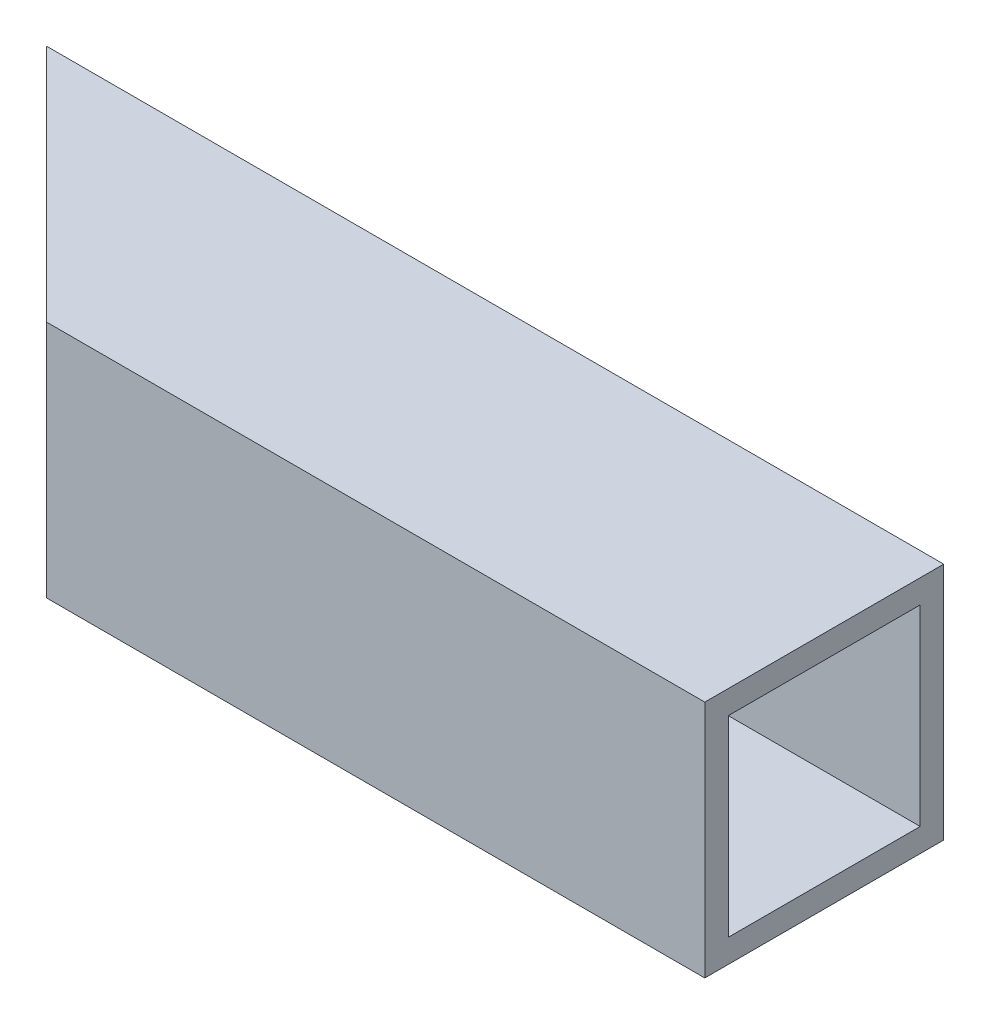
ISO-10303-21;
HEADER;
FILE_DESCRIPTION(('STEP AP214'),'2;1');
FILE_NAME('part.step','',(''),(''),'','','');
FILE_SCHEMA(('AUTOMOTIVE_DESIGN { 1 0 10303 214 1 1 1 1 }'));
ENDSEC;
DATA;
#1=APPLICATION_CONTEXT('core data for automotive mechanical design processes');
#2=APPLICATION_PROTOCOL_DEFINITION('international standard','automotive_design',2000,#1);
#3=PRODUCT_CONTEXT('',#1,'mechanical');
#4=PRODUCT('Part','Part','',(#3));
#5=PRODUCT_RELATED_PRODUCT_CATEGORY('part','',(#4));
#6=PRODUCT_DEFINITION_FORMATION('','',#4);
#7=PRODUCT_DEFINITION_CONTEXT('part definition',#1,'design');
#8=PRODUCT_DEFINITION('design','',#6,#7);
#9=PRODUCT_DEFINITION_SHAPE('','',#8);
#10=(LENGTH_UNIT() NAMED_UNIT(*) SI_UNIT(.MILLI.,.METRE.));
#11=(NAMED_UNIT(*) PLANE_ANGLE_UNIT() SI_UNIT($,.RADIAN.));
#12=(NAMED_UNIT(*) SI_UNIT($,.STERADIAN.) SOLID_ANGLE_UNIT());
#13=UNCERTAINTY_MEASURE_WITH_UNIT(LENGTH_MEASURE(1.E-05),#10,'distance_accuracy_value','');
#14=(GEOMETRIC_REPRESENTATION_CONTEXT(3) GLOBAL_UNCERTAINTY_ASSIGNED_CONTEXT((#13)) GLOBAL_UNIT_ASSIGNED_CONTEXT((#10,
#11,#12)) REPRESENTATION_CONTEXT('',''));
#15=CARTESIAN_POINT('',(0.,0.,0.));
#16=DIRECTION('',(0.,0.,1.));
#17=DIRECTION('',(1.,0.,0.));
#18=AXIS2_PLACEMENT_3D('',#15,#16,#17);
#19=CARTESIAN_POINT('',(95.4,0.,0.));
#20=DIRECTION('',(1.,0.,0.));
#21=DIRECTION('',(0.,0.,-1.));
#22=AXIS2_PLACEMENT_3D('',#19,#20,#21);
#23=PLANE('',#22);
#24=DIRECTION('',(0.,1.,0.));
#25=VECTOR('',#24,1.);
#26=CARTESIAN_POINT('',(95.4,12.7,-12.7));
#27=LINE('',#26,#25);
#28=CARTESIAN_POINT('',(95.4,-12.7,-12.7));
#29=VERTEX_POINT('',#28);
#30=CARTESIAN_POINT('',(95.4,12.7,-12.7));
#31=VERTEX_POINT('',#30);
#32=EDGE_CURVE('E148',#29,#31,#27,.T.);
#33=ORIENTED_EDGE('',*,*,#32,.T.);
#34=DIRECTION('',(0.,0.,1.));
#35=VECTOR('',#34,1.);
#36=CARTESIAN_POINT('',(95.4,12.7,12.7));
#37=LINE('',#36,#35);
#38=CARTESIAN_POINT('',(95.4,12.7,12.7));
#39=VERTEX_POINT('',#38);
#40=EDGE_CURVE('E143',#31,#39,#37,.T.);
#41=ORIENTED_EDGE('',*,*,#40,.T.);
#42=DIRECTION('',(0.,-1.,0.));
#43=VECTOR('',#42,1.);
#44=CARTESIAN_POINT('',(95.4,12.7,12.7));
#45=LINE('',#44,#43);
#46=CARTESIAN_POINT('',(95.4,-12.7,12.7));
#47=VERTEX_POINT('',#46);
#48=EDGE_CURVE('E159',#39,#47,#45,.T.);
#49=ORIENTED_EDGE('',*,*,#48,.T.);
#50=DIRECTION('',(0.,0.,-1.));
#51=VECTOR('',#50,1.);
#52=CARTESIAN_POINT('',(95.4,-12.7,12.7));
#53=LINE('',#52,#51);
#54=EDGE_CURVE('E129',#47,#29,#53,.T.);
#55=ORIENTED_EDGE('',*,*,#54,.T.);
#56=EDGE_LOOP('',(#33,#41,#49,#55));
#57=FACE_BOUND('',#56,.T.);
#58=DIRECTION('',(0.,0.,1.));
#59=VECTOR('',#58,1.);
#60=CARTESIAN_POINT('',(95.4,10.2,10.2));
#61=LINE('',#60,#59);
#62=CARTESIAN_POINT('',(95.4,10.2,-10.2));
#63=VERTEX_POINT('',#62);
#64=CARTESIAN_POINT('',(95.4,10.2,10.2));
#65=VERTEX_POINT('',#64);
#66=EDGE_CURVE('E179',#63,#65,#61,.T.);
#67=ORIENTED_EDGE('',*,*,#66,.F.);
#68=DIRECTION('',(0.,1.,0.));
#69=VECTOR('',#68,1.);
#70=CARTESIAN_POINT('',(95.4,10.2,-10.2));
#71=LINE('',#70,#69);
#72=CARTESIAN_POINT('',(95.4,-10.2,-10.2));
#73=VERTEX_POINT('',#72);
#74=EDGE_CURVE('E182',#73,#63,#71,.T.);
#75=ORIENTED_EDGE('',*,*,#74,.F.);
#76=DIRECTION('',(0.,0.,-1.));
#77=VECTOR('',#76,1.);
#78=CARTESIAN_POINT('',(95.4,-10.2,10.2));
#79=LINE('',#78,#77);
#80=CARTESIAN_POINT('',(95.4,-10.2,10.2));
#81=VERTEX_POINT('',#80);
#82=EDGE_CURVE('E173',#81,#73,#79,.T.);
#83=ORIENTED_EDGE('',*,*,#82,.F.);
#84=DIRECTION('',(0.,-1.,0.));
#85=VECTOR('',#84,1.);
#86=CARTESIAN_POINT('',(95.4,10.2,10.2));
#87=LINE('',#86,#85);
#88=EDGE_CURVE('E176',#65,#81,#87,.T.);
#89=ORIENTED_EDGE('',*,*,#88,.F.);
#90=EDGE_LOOP('',(#67,#75,#83,#89));
#91=FACE_BOUND('',#90,.T.);
#92=ADVANCED_FACE('F39',(#57,#91),#23,.T.);
#93=CARTESIAN_POINT('',(95.4,12.7,-12.7));
#94=DIRECTION('',(0.,0.,1.));
#95=DIRECTION('',(0.,-1.,0.));
#96=AXIS2_PLACEMENT_3D('',#93,#94,#95);
#97=PLANE('',#96);
#98=DIRECTION('',(0.,1.,0.));
#99=VECTOR('',#98,1.);
#100=CARTESIAN_POINT('',(0.,12.7,-12.7));
#101=LINE('',#100,#99);
#102=CARTESIAN_POINT('',(0.,-12.7,-12.7));
#103=VERTEX_POINT('',#102);
#104=CARTESIAN_POINT('',(0.,12.7,-12.7));
#105=VERTEX_POINT('',#104);
#106=EDGE_CURVE('E109',#103,#105,#101,.T.);
#107=ORIENTED_EDGE('',*,*,#106,.T.);
#108=DIRECTION('',(-1.,0.,0.));
#109=VECTOR('',#108,1.);
#110=CARTESIAN_POINT('',(95.4,12.7,-12.7));
#111=LINE('',#110,#109);
#112=EDGE_CURVE('E48',#31,#105,#111,.T.);
#113=ORIENTED_EDGE('',*,*,#112,.F.);
#114=ORIENTED_EDGE('',*,*,#32,.F.);
#115=DIRECTION('',(-1.,0.,0.));
#116=VECTOR('',#115,1.);
#117=CARTESIAN_POINT('',(95.4,-12.7,-12.7));
#118=LINE('',#117,#116);
#119=EDGE_CURVE('E131',#29,#103,#118,.T.);
#120=ORIENTED_EDGE('',*,*,#119,.T.);
#121=EDGE_LOOP('',(#107,#113,#114,#120));
#122=FACE_BOUND('',#121,.T.);
#123=ADVANCED_FACE('F41',(#122),#97,.F.);
#124=CARTESIAN_POINT('',(95.4,12.7,12.7));
#125=DIRECTION('',(0.,-1.,0.));
#126=DIRECTION('',(0.,0.,-1.));
#127=AXIS2_PLACEMENT_3D('',#124,#125,#126);
#128=PLANE('',#127);
#129=ORIENTED_EDGE('',*,*,#112,.T.);
#130=DIRECTION('',(-0.707106781186544,0.,-0.707106781186551));
#131=VECTOR('',#130,1.);
#132=CARTESIAN_POINT('',(0.,12.7,-12.7));
#133=LINE('',#132,#131);
#134=CARTESIAN_POINT('',(25.3999999999997,12.7,12.7));
#135=VERTEX_POINT('',#134);
#136=EDGE_CURVE('E115',#135,#105,#133,.T.);
#137=ORIENTED_EDGE('',*,*,#136,.F.);
#138=DIRECTION('',(-1.,0.,0.));
#139=VECTOR('',#138,1.);
#140=CARTESIAN_POINT('',(95.4,12.7,12.7));
#141=LINE('',#140,#139);
#142=EDGE_CURVE('E125',#39,#135,#141,.T.);
#143=ORIENTED_EDGE('',*,*,#142,.F.);
#144=ORIENTED_EDGE('',*,*,#40,.F.);
#145=EDGE_LOOP('',(#129,#137,#143,#144));
#146=FACE_BOUND('',#145,.T.);
#147=ADVANCED_FACE('F142',(#146),#128,.F.);
#148=CARTESIAN_POINT('',(95.4,12.7,12.7));
#149=DIRECTION('',(0.,0.,-1.));
#150=DIRECTION('',(0.,1.,0.));
#151=AXIS2_PLACEMENT_3D('',#148,#149,#150);
#152=PLANE('',#151);
#153=ORIENTED_EDGE('',*,*,#142,.T.);
#154=DIRECTION('',(0.,1.,0.));
#155=VECTOR('',#154,1.);
#156=CARTESIAN_POINT('',(25.3999999999997,-12.7,12.7));
#157=LINE('',#156,#155);
#158=CARTESIAN_POINT('',(25.3999999999997,-12.7,12.7));
#159=VERTEX_POINT('',#158);
#160=EDGE_CURVE('E106',#159,#135,#157,.T.);
#161=ORIENTED_EDGE('',*,*,#160,.F.);
#162=DIRECTION('',(-1.,0.,0.));
#163=VECTOR('',#162,1.);
#164=CARTESIAN_POINT('',(95.4,-12.7,12.7));
#165=LINE('',#164,#163);
#166=EDGE_CURVE('E122',#47,#159,#165,.T.);
#167=ORIENTED_EDGE('',*,*,#166,.F.);
#168=ORIENTED_EDGE('',*,*,#48,.F.);
#169=EDGE_LOOP('',(#153,#161,#167,#168));
#170=FACE_BOUND('',#169,.T.);
#171=ADVANCED_FACE('F120',(#170),#152,.F.);
#172=CARTESIAN_POINT('',(95.4,-12.7,12.7));
#173=DIRECTION('',(0.,1.,0.));
#174=DIRECTION('',(0.,0.,1.));
#175=AXIS2_PLACEMENT_3D('',#172,#173,#174);
#176=PLANE('',#175);
#177=ORIENTED_EDGE('',*,*,#166,.T.);
#178=DIRECTION('',(-0.707106781186544,0.,-0.707106781186551));
#179=VECTOR('',#178,1.);
#180=CARTESIAN_POINT('',(0.,-12.7,-12.7));
#181=LINE('',#180,#179);
#182=EDGE_CURVE('E103',#159,#103,#181,.T.);
#183=ORIENTED_EDGE('',*,*,#182,.T.);
#184=ORIENTED_EDGE('',*,*,#119,.F.);
#185=ORIENTED_EDGE('',*,*,#54,.F.);
#186=EDGE_LOOP('',(#177,#183,#184,#185));
#187=FACE_BOUND('',#186,.T.);
#188=ADVANCED_FACE('F128',(#187),#176,.F.);
#189=CARTESIAN_POINT('',(95.4,10.2,-10.2));
#190=DIRECTION('',(0.,0.,1.));
#191=DIRECTION('',(0.,-1.,0.));
#192=AXIS2_PLACEMENT_3D('',#189,#190,#191);
#193=PLANE('',#192);
#194=DIRECTION('',(0.,1.,0.));
#195=VECTOR('',#194,1.);
#196=CARTESIAN_POINT('',(2.49999999999999,10.2,-10.2));
#197=LINE('',#196,#195);
#198=CARTESIAN_POINT('',(2.49999999999997,-10.2,-10.2));
#199=VERTEX_POINT('',#198);
#200=CARTESIAN_POINT('',(2.49999999999999,10.2,-10.2));
#201=VERTEX_POINT('',#200);
#202=EDGE_CURVE('E185',#199,#201,#197,.T.);
#203=ORIENTED_EDGE('',*,*,#202,.F.);
#204=DIRECTION('',(-1.,0.,0.));
#205=VECTOR('',#204,1.);
#206=CARTESIAN_POINT('',(95.4,-10.2,-10.2));
#207=LINE('',#206,#205);
#208=EDGE_CURVE('E169',#73,#199,#207,.T.);
#209=ORIENTED_EDGE('',*,*,#208,.F.);
#210=ORIENTED_EDGE('',*,*,#74,.T.);
#211=DIRECTION('',(-1.,0.,0.));
#212=VECTOR('',#211,1.);
#213=CARTESIAN_POINT('',(95.4,10.2,-10.2));
#214=LINE('',#213,#212);
#215=EDGE_CURVE('E149',#63,#201,#214,.T.);
#216=ORIENTED_EDGE('',*,*,#215,.T.);
#217=EDGE_LOOP('',(#203,#209,#210,#216));
#218=FACE_BOUND('',#217,.T.);
#219=ADVANCED_FACE('F210',(#218),#193,.T.);
#220=CARTESIAN_POINT('',(95.4,10.2,10.2));
#221=DIRECTION('',(0.,-1.,0.));
#222=DIRECTION('',(0.,0.,-1.));
#223=AXIS2_PLACEMENT_3D('',#220,#221,#222);
#224=PLANE('',#223);
#225=DIRECTION('',(0.707106781186544,0.,0.707106781186551));
#226=VECTOR('',#225,1.);
#227=CARTESIAN_POINT('',(59.1499999999995,10.2,46.4500000000001));
#228=LINE('',#227,#226);
#229=CARTESIAN_POINT('',(22.8999999999998,10.2,10.2));
#230=VERTEX_POINT('',#229);
#231=EDGE_CURVE('E188',#201,#230,#228,.T.);
#232=ORIENTED_EDGE('',*,*,#231,.F.);
#233=ORIENTED_EDGE('',*,*,#215,.F.);
#234=ORIENTED_EDGE('',*,*,#66,.T.);
#235=DIRECTION('',(-1.,0.,0.));
#236=VECTOR('',#235,1.);
#237=CARTESIAN_POINT('',(95.4,10.2,10.2));
#238=LINE('',#237,#236);
#239=EDGE_CURVE('E154',#65,#230,#238,.T.);
#240=ORIENTED_EDGE('',*,*,#239,.T.);
#241=EDGE_LOOP('',(#232,#233,#234,#240));
#242=FACE_BOUND('',#241,.T.);
#243=ADVANCED_FACE('F202',(#242),#224,.T.);
#244=CARTESIAN_POINT('',(95.4,10.2,10.2));
#245=DIRECTION('',(0.,0.,-1.));
#246=DIRECTION('',(0.,1.,0.));
#247=AXIS2_PLACEMENT_3D('',#244,#245,#246);
#248=PLANE('',#247);
#249=DIRECTION('',(0.,-1.,0.));
#250=VECTOR('',#249,1.);
#251=CARTESIAN_POINT('',(22.8999999999998,10.2,10.2));
#252=LINE('',#251,#250);
#253=CARTESIAN_POINT('',(22.8999999999998,-10.2,10.2));
#254=VERTEX_POINT('',#253);
#255=EDGE_CURVE('E54',#230,#254,#252,.T.);
#256=ORIENTED_EDGE('',*,*,#255,.F.);
#257=ORIENTED_EDGE('',*,*,#239,.F.);
#258=ORIENTED_EDGE('',*,*,#88,.T.);
#259=DIRECTION('',(-1.,0.,0.));
#260=VECTOR('',#259,1.);
#261=CARTESIAN_POINT('',(95.4,-10.2,10.2));
#262=LINE('',#261,#260);
#263=EDGE_CURVE('E61',#81,#254,#262,.T.);
#264=ORIENTED_EDGE('',*,*,#263,.T.);
#265=EDGE_LOOP('',(#256,#257,#258,#264));
#266=FACE_BOUND('',#265,.T.);
#267=ADVANCED_FACE('F200',(#266),#248,.T.);
#268=CARTESIAN_POINT('',(95.4,-10.2,10.2));
#269=DIRECTION('',(0.,1.,0.));
#270=DIRECTION('',(0.,0.,1.));
#271=AXIS2_PLACEMENT_3D('',#268,#269,#270);
#272=PLANE('',#271);
#273=DIRECTION('',(-0.707106781186544,0.,-0.707106781186551));
#274=VECTOR('',#273,1.);
#275=CARTESIAN_POINT('',(59.1499999999995,-10.2,46.4500000000001));
#276=LINE('',#275,#274);
#277=EDGE_CURVE('E11',#254,#199,#276,.T.);
#278=ORIENTED_EDGE('',*,*,#277,.F.);
#279=ORIENTED_EDGE('',*,*,#263,.F.);
#280=ORIENTED_EDGE('',*,*,#82,.T.);
#281=ORIENTED_EDGE('',*,*,#208,.T.);
#282=EDGE_LOOP('',(#278,#279,#280,#281));
#283=FACE_BOUND('',#282,.T.);
#284=ADVANCED_FACE('F208',(#283),#272,.T.);
#285=CARTESIAN_POINT('',(0.,-12.7,-12.7));
#286=DIRECTION('',(0.707106781186551,0.,-0.707106781186544));
#287=DIRECTION('',(-0.707106781186544,0.,-0.707106781186551));
#288=AXIS2_PLACEMENT_3D('',#285,#286,#287);
#289=PLANE('',#288);
#290=ORIENTED_EDGE('',*,*,#202,.T.);
#291=ORIENTED_EDGE('',*,*,#231,.T.);
#292=ORIENTED_EDGE('',*,*,#255,.T.);
#293=ORIENTED_EDGE('',*,*,#277,.T.);
#294=EDGE_LOOP('',(#290,#291,#292,#293));
#295=FACE_BOUND('',#294,.T.);
#296=ORIENTED_EDGE('',*,*,#136,.T.);
#297=ORIENTED_EDGE('',*,*,#106,.F.);
#298=ORIENTED_EDGE('',*,*,#182,.F.);
#299=ORIENTED_EDGE('',*,*,#160,.T.);
#300=EDGE_LOOP('',(#296,#297,#298,#299));
#301=FACE_BOUND('',#300,.T.);
#302=ADVANCED_FACE('F105',(#295,#301),#289,.F.);
#303=CLOSED_SHELL('',(#92,#123,#147,#171,#188,#219,#243,#267,#284,#302));
#304=MANIFOLD_SOLID_BREP('B2',#303);
#305=ADVANCED_BREP_SHAPE_REPRESENTATION('',(#18,#304),#14);
#306=SHAPE_DEFINITION_REPRESENTATION(#9,#305);
ENDSEC;
END-ISO-10303-21;
